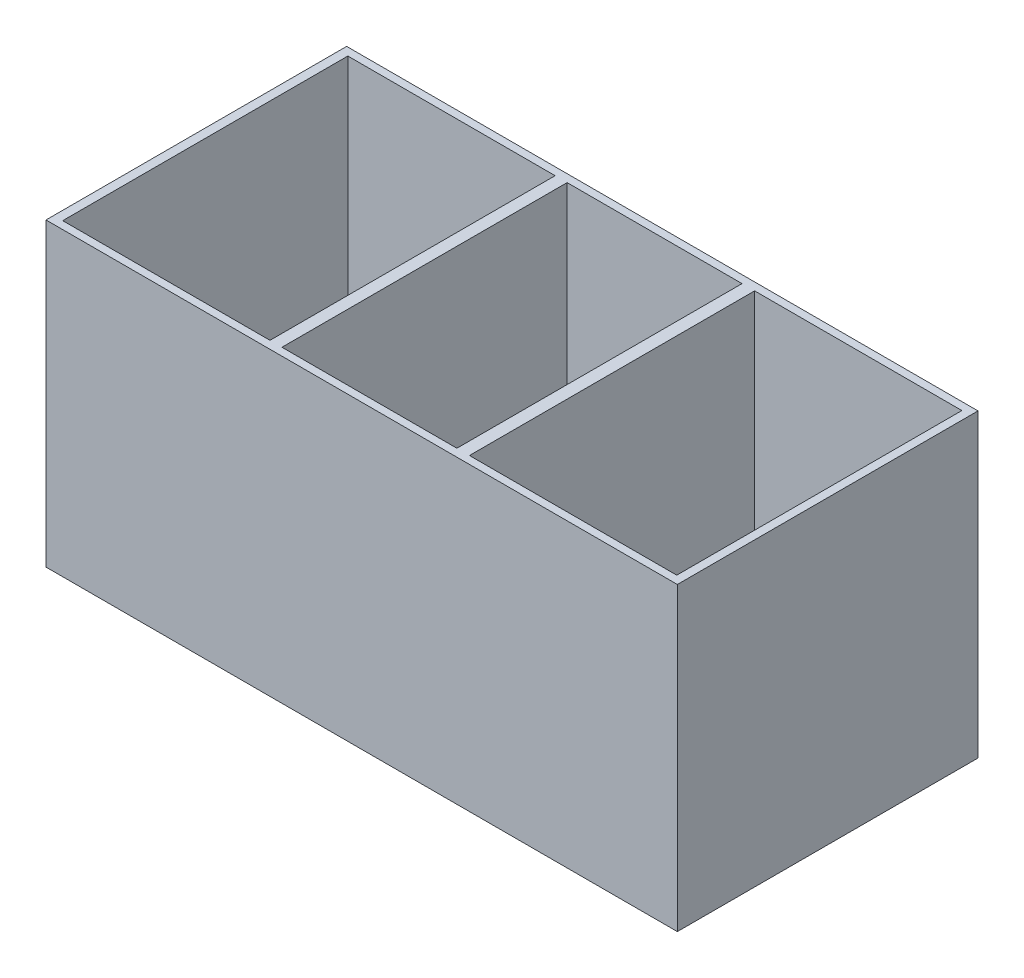
ISO-10303-21;
HEADER;
FILE_DESCRIPTION(('STEP AP214'),'2;1');
FILE_NAME('part.step','',(''),(''),'','','');
FILE_SCHEMA(('AUTOMOTIVE_DESIGN { 1 0 10303 214 1 1 1 1 }'));
ENDSEC;
DATA;
#1=APPLICATION_CONTEXT('core data for automotive mechanical design processes');
#2=APPLICATION_PROTOCOL_DEFINITION('international standard','automotive_design',2000,#1);
#3=PRODUCT_CONTEXT('',#1,'mechanical');
#4=PRODUCT('Part','Part','',(#3));
#5=PRODUCT_RELATED_PRODUCT_CATEGORY('part','',(#4));
#6=PRODUCT_DEFINITION_FORMATION('','',#4);
#7=PRODUCT_DEFINITION_CONTEXT('part definition',#1,'design');
#8=PRODUCT_DEFINITION('design','',#6,#7);
#9=PRODUCT_DEFINITION_SHAPE('','',#8);
#10=(LENGTH_UNIT() NAMED_UNIT(*) SI_UNIT(.MILLI.,.METRE.));
#11=(NAMED_UNIT(*) PLANE_ANGLE_UNIT() SI_UNIT($,.RADIAN.));
#12=(NAMED_UNIT(*) SI_UNIT($,.STERADIAN.) SOLID_ANGLE_UNIT());
#13=UNCERTAINTY_MEASURE_WITH_UNIT(LENGTH_MEASURE(1.E-05),#10,'distance_accuracy_value','');
#14=(GEOMETRIC_REPRESENTATION_CONTEXT(3) GLOBAL_UNCERTAINTY_ASSIGNED_CONTEXT((#13)) GLOBAL_UNIT_ASSIGNED_CONTEXT((#10,
#11,#12)) REPRESENTATION_CONTEXT('',''));
#15=CARTESIAN_POINT('',(0.,0.,0.));
#16=DIRECTION('',(0.,0.,1.));
#17=DIRECTION('',(1.,0.,0.));
#18=AXIS2_PLACEMENT_3D('',#15,#16,#17);
#19=CARTESIAN_POINT('',(105.,100.,-50.));
#20=DIRECTION('',(-1.,0.,0.));
#21=DIRECTION('',(0.,0.,1.));
#22=AXIS2_PLACEMENT_3D('',#19,#20,#21);
#23=PLANE('',#22);
#24=DIRECTION('',(0.,0.,-1.));
#25=VECTOR('',#24,1.);
#26=CARTESIAN_POINT('',(105.,0.,-50.));
#27=LINE('',#26,#25);
#28=CARTESIAN_POINT('',(105.,0.,50.));
#29=VERTEX_POINT('',#28);
#30=CARTESIAN_POINT('',(105.,0.,-50.));
#31=VERTEX_POINT('',#30);
#32=EDGE_CURVE('E186',#29,#31,#27,.T.);
#33=ORIENTED_EDGE('',*,*,#32,.T.);
#34=DIRECTION('',(0.,-1.,0.));
#35=VECTOR('',#34,1.);
#36=CARTESIAN_POINT('',(105.,100.,-50.));
#37=LINE('',#36,#35);
#38=CARTESIAN_POINT('',(105.,100.,-50.));
#39=VERTEX_POINT('',#38);
#40=EDGE_CURVE('E11',#39,#31,#37,.T.);
#41=ORIENTED_EDGE('',*,*,#40,.F.);
#42=DIRECTION('',(0.,0.,-1.));
#43=VECTOR('',#42,1.);
#44=CARTESIAN_POINT('',(105.,100.,-50.));
#45=LINE('',#44,#43);
#46=CARTESIAN_POINT('',(105.,100.,50.));
#47=VERTEX_POINT('',#46);
#48=EDGE_CURVE('E255',#47,#39,#45,.T.);
#49=ORIENTED_EDGE('',*,*,#48,.F.);
#50=DIRECTION('',(0.,-1.,0.));
#51=VECTOR('',#50,1.);
#52=CARTESIAN_POINT('',(105.,100.,50.));
#53=LINE('',#52,#51);
#54=EDGE_CURVE('E265',#47,#29,#53,.T.);
#55=ORIENTED_EDGE('',*,*,#54,.T.);
#56=EDGE_LOOP('',(#33,#41,#49,#55));
#57=FACE_BOUND('',#56,.T.);
#58=ADVANCED_FACE('F39',(#57),#23,.F.);
#59=CARTESIAN_POINT('',(-105.,100.,-50.));
#60=DIRECTION('',(0.,0.,1.));
#61=DIRECTION('',(1.,0.,0.));
#62=AXIS2_PLACEMENT_3D('',#59,#60,#61);
#63=PLANE('',#62);
#64=DIRECTION('',(-1.,0.,0.));
#65=VECTOR('',#64,1.);
#66=CARTESIAN_POINT('',(-105.,0.,-50.));
#67=LINE('',#66,#65);
#68=CARTESIAN_POINT('',(-105.,0.,-50.));
#69=VERTEX_POINT('',#68);
#70=EDGE_CURVE('E262',#31,#69,#67,.T.);
#71=ORIENTED_EDGE('',*,*,#70,.T.);
#72=DIRECTION('',(0.,-1.,0.));
#73=VECTOR('',#72,1.);
#74=CARTESIAN_POINT('',(-105.,100.,-50.));
#75=LINE('',#74,#73);
#76=CARTESIAN_POINT('',(-105.,100.,-50.));
#77=VERTEX_POINT('',#76);
#78=EDGE_CURVE('E46',#77,#69,#75,.T.);
#79=ORIENTED_EDGE('',*,*,#78,.F.);
#80=DIRECTION('',(-1.,0.,0.));
#81=VECTOR('',#80,1.);
#82=CARTESIAN_POINT('',(-105.,100.,-50.));
#83=LINE('',#82,#81);
#84=EDGE_CURVE('E251',#39,#77,#83,.T.);
#85=ORIENTED_EDGE('',*,*,#84,.F.);
#86=ORIENTED_EDGE('',*,*,#40,.T.);
#87=EDGE_LOOP('',(#71,#79,#85,#86));
#88=FACE_BOUND('',#87,.T.);
#89=ADVANCED_FACE('F293',(#88),#63,.F.);
#90=CARTESIAN_POINT('',(-105.,100.,-50.));
#91=DIRECTION('',(1.,0.,0.));
#92=DIRECTION('',(0.,0.,-1.));
#93=AXIS2_PLACEMENT_3D('',#90,#91,#92);
#94=PLANE('',#93);
#95=DIRECTION('',(0.,0.,1.));
#96=VECTOR('',#95,1.);
#97=CARTESIAN_POINT('',(-105.,0.,-50.));
#98=LINE('',#97,#96);
#99=CARTESIAN_POINT('',(-105.,0.,50.));
#100=VERTEX_POINT('',#99);
#101=EDGE_CURVE('E270',#69,#100,#98,.T.);
#102=ORIENTED_EDGE('',*,*,#101,.T.);
#103=DIRECTION('',(0.,-1.,0.));
#104=VECTOR('',#103,1.);
#105=CARTESIAN_POINT('',(-105.,100.,50.));
#106=LINE('',#105,#104);
#107=CARTESIAN_POINT('',(-105.,100.,50.));
#108=VERTEX_POINT('',#107);
#109=EDGE_CURVE('E275',#108,#100,#106,.T.);
#110=ORIENTED_EDGE('',*,*,#109,.F.);
#111=DIRECTION('',(0.,0.,1.));
#112=VECTOR('',#111,1.);
#113=CARTESIAN_POINT('',(-105.,100.,-50.));
#114=LINE('',#113,#112);
#115=EDGE_CURVE('E256',#77,#108,#114,.T.);
#116=ORIENTED_EDGE('',*,*,#115,.F.);
#117=ORIENTED_EDGE('',*,*,#78,.T.);
#118=EDGE_LOOP('',(#102,#110,#116,#117));
#119=FACE_BOUND('',#118,.T.);
#120=ADVANCED_FACE('F278',(#119),#94,.F.);
#121=CARTESIAN_POINT('',(-105.,100.,50.));
#122=DIRECTION('',(0.,0.,-1.));
#123=DIRECTION('',(-1.,0.,0.));
#124=AXIS2_PLACEMENT_3D('',#121,#122,#123);
#125=PLANE('',#124);
#126=DIRECTION('',(1.,0.,0.));
#127=VECTOR('',#126,1.);
#128=CARTESIAN_POINT('',(-105.,0.,50.));
#129=LINE('',#128,#127);
#130=EDGE_CURVE('E258',#100,#29,#129,.T.);
#131=ORIENTED_EDGE('',*,*,#130,.T.);
#132=ORIENTED_EDGE('',*,*,#54,.F.);
#133=DIRECTION('',(1.,0.,0.));
#134=VECTOR('',#133,1.);
#135=CARTESIAN_POINT('',(-105.,100.,50.));
#136=LINE('',#135,#134);
#137=EDGE_CURVE('E259',#108,#47,#136,.T.);
#138=ORIENTED_EDGE('',*,*,#137,.F.);
#139=ORIENTED_EDGE('',*,*,#109,.T.);
#140=EDGE_LOOP('',(#131,#132,#138,#139));
#141=FACE_BOUND('',#140,.T.);
#142=ADVANCED_FACE('F288',(#141),#125,.F.);
#143=CARTESIAN_POINT('',(0.,100.,0.));
#144=DIRECTION('',(0.,1.,0.));
#145=DIRECTION('',(0.,0.,1.));
#146=AXIS2_PLACEMENT_3D('',#143,#144,#145);
#147=PLANE('',#146);
#148=DIRECTION('',(0.,0.,-1.));
#149=VECTOR('',#148,1.);
#150=CARTESIAN_POINT('',(-33.0770005215608,100.,-47.4236513501892));
#151=LINE('',#150,#149);
#152=CARTESIAN_POINT('',(-33.0770005215608,100.,47.4236513501892));
#153=VERTEX_POINT('',#152);
#154=CARTESIAN_POINT('',(-33.0770005215608,100.,-47.4236513501892));
#155=VERTEX_POINT('',#154);
#156=EDGE_CURVE('E52',#153,#155,#151,.T.);
#157=ORIENTED_EDGE('',*,*,#156,.F.);
#158=DIRECTION('',(1.,0.,0.));
#159=VECTOR('',#158,1.);
#160=CARTESIAN_POINT('',(-102.020628114694,100.,47.4236513501892));
#161=LINE('',#160,#159);
#162=CARTESIAN_POINT('',(-102.020628114694,100.,47.4236513501892));
#163=VERTEX_POINT('',#162);
#164=EDGE_CURVE('E173',#163,#153,#161,.T.);
#165=ORIENTED_EDGE('',*,*,#164,.F.);
#166=DIRECTION('',(0.,0.,1.));
#167=VECTOR('',#166,1.);
#168=CARTESIAN_POINT('',(-102.020628114694,100.,-47.4236513501892));
#169=LINE('',#168,#167);
#170=CARTESIAN_POINT('',(-102.020628114694,100.,-47.4236513501892));
#171=VERTEX_POINT('',#170);
#172=EDGE_CURVE('E174',#171,#163,#169,.T.);
#173=ORIENTED_EDGE('',*,*,#172,.F.);
#174=DIRECTION('',(-1.,0.,0.));
#175=VECTOR('',#174,1.);
#176=CARTESIAN_POINT('',(-102.020628114694,100.,-47.4236513501892));
#177=LINE('',#176,#175);
#178=EDGE_CURVE('E179',#155,#171,#177,.T.);
#179=ORIENTED_EDGE('',*,*,#178,.F.);
#180=EDGE_LOOP('',(#157,#165,#173,#179));
#181=FACE_BOUND('',#180,.T.);
#182=DIRECTION('',(0.,0.,-1.));
#183=VECTOR('',#182,1.);
#184=CARTESIAN_POINT('',(29.0918197358305,100.,-47.4236513501892));
#185=LINE('',#184,#183);
#186=CARTESIAN_POINT('',(29.0918197358305,100.,47.4236513501892));
#187=VERTEX_POINT('',#186);
#188=CARTESIAN_POINT('',(29.0918197358305,100.,-47.4236513501892));
#189=VERTEX_POINT('',#188);
#190=EDGE_CURVE('E62',#187,#189,#185,.T.);
#191=ORIENTED_EDGE('',*,*,#190,.F.);
#192=DIRECTION('',(1.,0.,0.));
#193=VECTOR('',#192,1.);
#194=CARTESIAN_POINT('',(-29.0918197358305,100.,47.4236513501892));
#195=LINE('',#194,#193);
#196=CARTESIAN_POINT('',(-29.0918197358305,100.,47.4236513501892));
#197=VERTEX_POINT('',#196);
#198=EDGE_CURVE('E196',#197,#187,#195,.T.);
#199=ORIENTED_EDGE('',*,*,#198,.F.);
#200=DIRECTION('',(0.,0.,1.));
#201=VECTOR('',#200,1.);
#202=CARTESIAN_POINT('',(-29.0918197358305,100.,-47.4236513501892));
#203=LINE('',#202,#201);
#204=CARTESIAN_POINT('',(-29.0918197358305,100.,-47.4236513501892));
#205=VERTEX_POINT('',#204);
#206=EDGE_CURVE('E201',#205,#197,#203,.T.);
#207=ORIENTED_EDGE('',*,*,#206,.F.);
#208=DIRECTION('',(-1.,0.,0.));
#209=VECTOR('',#208,1.);
#210=CARTESIAN_POINT('',(-29.0918197358305,100.,-47.4236513501892));
#211=LINE('',#210,#209);
#212=EDGE_CURVE('E210',#189,#205,#211,.T.);
#213=ORIENTED_EDGE('',*,*,#212,.F.);
#214=EDGE_LOOP('',(#191,#199,#207,#213));
#215=FACE_BOUND('',#214,.T.);
#216=DIRECTION('',(0.,0.,-1.));
#217=VECTOR('',#216,1.);
#218=CARTESIAN_POINT('',(102.21988715398,100.,-47.4236513501892));
#219=LINE('',#218,#217);
#220=CARTESIAN_POINT('',(102.21988715398,100.,47.4236513501892));
#221=VERTEX_POINT('',#220);
#222=CARTESIAN_POINT('',(102.21988715398,100.,-47.4236513501892));
#223=VERTEX_POINT('',#222);
#224=EDGE_CURVE('E199',#221,#223,#219,.T.);
#225=ORIENTED_EDGE('',*,*,#224,.F.);
#226=DIRECTION('',(1.,0.,0.));
#227=VECTOR('',#226,1.);
#228=CARTESIAN_POINT('',(33.2762595608473,100.,47.4236513501892));
#229=LINE('',#228,#227);
#230=CARTESIAN_POINT('',(33.2762595608473,100.,47.4236513501892));
#231=VERTEX_POINT('',#230);
#232=EDGE_CURVE('E231',#231,#221,#229,.T.);
#233=ORIENTED_EDGE('',*,*,#232,.F.);
#234=DIRECTION('',(0.,0.,1.));
#235=VECTOR('',#234,1.);
#236=CARTESIAN_POINT('',(33.2762595608473,100.,-47.4236513501892));
#237=LINE('',#236,#235);
#238=CARTESIAN_POINT('',(33.2762595608473,100.,-47.4236513501892));
#239=VERTEX_POINT('',#238);
#240=EDGE_CURVE('E233',#239,#231,#237,.T.);
#241=ORIENTED_EDGE('',*,*,#240,.F.);
#242=DIRECTION('',(-1.,0.,0.));
#243=VECTOR('',#242,1.);
#244=CARTESIAN_POINT('',(33.2762595608473,100.,-47.4236513501892));
#245=LINE('',#244,#243);
#246=EDGE_CURVE('E239',#223,#239,#245,.T.);
#247=ORIENTED_EDGE('',*,*,#246,.F.);
#248=EDGE_LOOP('',(#225,#233,#241,#247));
#249=FACE_BOUND('',#248,.T.);
#250=ORIENTED_EDGE('',*,*,#48,.T.);
#251=ORIENTED_EDGE('',*,*,#84,.T.);
#252=ORIENTED_EDGE('',*,*,#115,.T.);
#253=ORIENTED_EDGE('',*,*,#137,.T.);
#254=EDGE_LOOP('',(#250,#251,#252,#253));
#255=FACE_BOUND('',#254,.T.);
#256=ADVANCED_FACE('F294',(#181,#215,#249,#255),#147,.T.);
#257=CARTESIAN_POINT('',(0.,0.,0.));
#258=DIRECTION('',(0.,1.,0.));
#259=DIRECTION('',(0.,0.,1.));
#260=AXIS2_PLACEMENT_3D('',#257,#258,#259);
#261=PLANE('',#260);
#262=ORIENTED_EDGE('',*,*,#32,.F.);
#263=ORIENTED_EDGE('',*,*,#130,.F.);
#264=ORIENTED_EDGE('',*,*,#101,.F.);
#265=ORIENTED_EDGE('',*,*,#70,.F.);
#266=EDGE_LOOP('',(#262,#263,#264,#265));
#267=FACE_BOUND('',#266,.T.);
#268=ADVANCED_FACE('F283',(#267),#261,.F.);
#269=CARTESIAN_POINT('',(102.21988715398,5.,-47.4236513501892));
#270=DIRECTION('',(1.,0.,0.));
#271=DIRECTION('',(0.,0.,-1.));
#272=AXIS2_PLACEMENT_3D('',#269,#270,#271);
#273=PLANE('',#272);
#274=ORIENTED_EDGE('',*,*,#224,.T.);
#275=DIRECTION('',(0.,1.,0.));
#276=VECTOR('',#275,1.);
#277=CARTESIAN_POINT('',(102.21988715398,5.,-47.4236513501892));
#278=LINE('',#277,#276);
#279=CARTESIAN_POINT('',(102.21988715398,5.,-47.4236513501892));
#280=VERTEX_POINT('',#279);
#281=EDGE_CURVE('E221',#280,#223,#278,.T.);
#282=ORIENTED_EDGE('',*,*,#281,.F.);
#283=DIRECTION('',(0.,0.,-1.));
#284=VECTOR('',#283,1.);
#285=CARTESIAN_POINT('',(102.21988715398,5.,-47.4236513501892));
#286=LINE('',#285,#284);
#287=CARTESIAN_POINT('',(102.21988715398,5.,47.4236513501892));
#288=VERTEX_POINT('',#287);
#289=EDGE_CURVE('E234',#288,#280,#286,.T.);
#290=ORIENTED_EDGE('',*,*,#289,.F.);
#291=DIRECTION('',(0.,1.,0.));
#292=VECTOR('',#291,1.);
#293=CARTESIAN_POINT('',(102.21988715398,5.,47.4236513501892));
#294=LINE('',#293,#292);
#295=EDGE_CURVE('E227',#288,#221,#294,.T.);
#296=ORIENTED_EDGE('',*,*,#295,.T.);
#297=EDGE_LOOP('',(#274,#282,#290,#296));
#298=FACE_BOUND('',#297,.T.);
#299=ADVANCED_FACE('F310',(#298),#273,.F.);
#300=CARTESIAN_POINT('',(33.2762595608473,5.,47.4236513501892));
#301=DIRECTION('',(0.,0.,1.));
#302=DIRECTION('',(1.,0.,0.));
#303=AXIS2_PLACEMENT_3D('',#300,#301,#302);
#304=PLANE('',#303);
#305=ORIENTED_EDGE('',*,*,#232,.T.);
#306=ORIENTED_EDGE('',*,*,#295,.F.);
#307=DIRECTION('',(1.,0.,0.));
#308=VECTOR('',#307,1.);
#309=CARTESIAN_POINT('',(33.2762595608473,5.,47.4236513501892));
#310=LINE('',#309,#308);
#311=CARTESIAN_POINT('',(33.2762595608473,5.,47.4236513501892));
#312=VERTEX_POINT('',#311);
#313=EDGE_CURVE('E222',#312,#288,#310,.T.);
#314=ORIENTED_EDGE('',*,*,#313,.F.);
#315=DIRECTION('',(0.,1.,0.));
#316=VECTOR('',#315,1.);
#317=CARTESIAN_POINT('',(33.2762595608473,5.,47.4236513501892));
#318=LINE('',#317,#316);
#319=EDGE_CURVE('E230',#312,#231,#318,.T.);
#320=ORIENTED_EDGE('',*,*,#319,.T.);
#321=EDGE_LOOP('',(#305,#306,#314,#320));
#322=FACE_BOUND('',#321,.T.);
#323=ADVANCED_FACE('F320',(#322),#304,.F.);
#324=CARTESIAN_POINT('',(33.2762595608473,5.,-47.4236513501892));
#325=DIRECTION('',(-1.,0.,0.));
#326=DIRECTION('',(0.,0.,1.));
#327=AXIS2_PLACEMENT_3D('',#324,#325,#326);
#328=PLANE('',#327);
#329=ORIENTED_EDGE('',*,*,#240,.T.);
#330=ORIENTED_EDGE('',*,*,#319,.F.);
#331=DIRECTION('',(0.,0.,1.));
#332=VECTOR('',#331,1.);
#333=CARTESIAN_POINT('',(33.2762595608473,5.,-47.4236513501892));
#334=LINE('',#333,#332);
#335=CARTESIAN_POINT('',(33.2762595608473,5.,-47.4236513501892));
#336=VERTEX_POINT('',#335);
#337=EDGE_CURVE('E244',#336,#312,#334,.T.);
#338=ORIENTED_EDGE('',*,*,#337,.F.);
#339=DIRECTION('',(0.,1.,0.));
#340=VECTOR('',#339,1.);
#341=CARTESIAN_POINT('',(33.2762595608473,5.,-47.4236513501892));
#342=LINE('',#341,#340);
#343=EDGE_CURVE('E224',#336,#239,#342,.T.);
#344=ORIENTED_EDGE('',*,*,#343,.T.);
#345=EDGE_LOOP('',(#329,#330,#338,#344));
#346=FACE_BOUND('',#345,.T.);
#347=ADVANCED_FACE('F319',(#346),#328,.F.);
#348=CARTESIAN_POINT('',(33.2762595608473,5.,-47.4236513501892));
#349=DIRECTION('',(0.,0.,-1.));
#350=DIRECTION('',(-1.,0.,0.));
#351=AXIS2_PLACEMENT_3D('',#348,#349,#350);
#352=PLANE('',#351);
#353=ORIENTED_EDGE('',*,*,#246,.T.);
#354=ORIENTED_EDGE('',*,*,#343,.F.);
#355=DIRECTION('',(-1.,0.,0.));
#356=VECTOR('',#355,1.);
#357=CARTESIAN_POINT('',(33.2762595608473,5.,-47.4236513501892));
#358=LINE('',#357,#356);
#359=EDGE_CURVE('E250',#280,#336,#358,.T.);
#360=ORIENTED_EDGE('',*,*,#359,.F.);
#361=ORIENTED_EDGE('',*,*,#281,.T.);
#362=EDGE_LOOP('',(#353,#354,#360,#361));
#363=FACE_BOUND('',#362,.T.);
#364=ADVANCED_FACE('F314',(#363),#352,.F.);
#365=CARTESIAN_POINT('',(0.,5.,0.));
#366=DIRECTION('',(0.,1.,0.));
#367=DIRECTION('',(0.,0.,1.));
#368=AXIS2_PLACEMENT_3D('',#365,#366,#367);
#369=PLANE('',#368);
#370=ORIENTED_EDGE('',*,*,#289,.T.);
#371=ORIENTED_EDGE('',*,*,#359,.T.);
#372=ORIENTED_EDGE('',*,*,#337,.T.);
#373=ORIENTED_EDGE('',*,*,#313,.T.);
#374=EDGE_LOOP('',(#370,#371,#372,#373));
#375=FACE_BOUND('',#374,.T.);
#376=ADVANCED_FACE('F311',(#375),#369,.T.);
#377=CARTESIAN_POINT('',(29.0918197358305,5.,-47.4236513501892));
#378=DIRECTION('',(1.,0.,0.));
#379=DIRECTION('',(0.,0.,-1.));
#380=AXIS2_PLACEMENT_3D('',#377,#378,#379);
#381=PLANE('',#380);
#382=ORIENTED_EDGE('',*,*,#190,.T.);
#383=DIRECTION('',(0.,1.,0.));
#384=VECTOR('',#383,1.);
#385=CARTESIAN_POINT('',(29.0918197358305,5.,-47.4236513501892));
#386=LINE('',#385,#384);
#387=CARTESIAN_POINT('',(29.0918197358305,5.,-47.4236513501892));
#388=VERTEX_POINT('',#387);
#389=EDGE_CURVE('E189',#388,#189,#386,.T.);
#390=ORIENTED_EDGE('',*,*,#389,.F.);
#391=DIRECTION('',(0.,0.,-1.));
#392=VECTOR('',#391,1.);
#393=CARTESIAN_POINT('',(29.0918197358305,5.,-47.4236513501892));
#394=LINE('',#393,#392);
#395=CARTESIAN_POINT('',(29.0918197358305,5.,47.4236513501892));
#396=VERTEX_POINT('',#395);
#397=EDGE_CURVE('E204',#396,#388,#394,.T.);
#398=ORIENTED_EDGE('',*,*,#397,.F.);
#399=DIRECTION('',(0.,1.,0.));
#400=VECTOR('',#399,1.);
#401=CARTESIAN_POINT('',(29.0918197358305,5.,47.4236513501892));
#402=LINE('',#401,#400);
#403=EDGE_CURVE('E200',#396,#187,#402,.T.);
#404=ORIENTED_EDGE('',*,*,#403,.T.);
#405=EDGE_LOOP('',(#382,#390,#398,#404));
#406=FACE_BOUND('',#405,.T.);
#407=ADVANCED_FACE('F312',(#406),#381,.F.);
#408=CARTESIAN_POINT('',(-29.0918197358305,5.,47.4236513501892));
#409=DIRECTION('',(0.,0.,1.));
#410=DIRECTION('',(1.,0.,0.));
#411=AXIS2_PLACEMENT_3D('',#408,#409,#410);
#412=PLANE('',#411);
#413=ORIENTED_EDGE('',*,*,#198,.T.);
#414=ORIENTED_EDGE('',*,*,#403,.F.);
#415=DIRECTION('',(1.,0.,0.));
#416=VECTOR('',#415,1.);
#417=CARTESIAN_POINT('',(-29.0918197358305,5.,47.4236513501892));
#418=LINE('',#417,#416);
#419=CARTESIAN_POINT('',(-29.0918197358305,5.,47.4236513501892));
#420=VERTEX_POINT('',#419);
#421=EDGE_CURVE('E195',#420,#396,#418,.T.);
#422=ORIENTED_EDGE('',*,*,#421,.F.);
#423=DIRECTION('',(0.,1.,0.));
#424=VECTOR('',#423,1.);
#425=CARTESIAN_POINT('',(-29.0918197358305,5.,47.4236513501892));
#426=LINE('',#425,#424);
#427=EDGE_CURVE('E193',#420,#197,#426,.T.);
#428=ORIENTED_EDGE('',*,*,#427,.T.);
#429=EDGE_LOOP('',(#413,#414,#422,#428));
#430=FACE_BOUND('',#429,.T.);
#431=ADVANCED_FACE('F337',(#430),#412,.F.);
#432=CARTESIAN_POINT('',(-29.0918197358305,5.,-47.4236513501892));
#433=DIRECTION('',(-1.,0.,0.));
#434=DIRECTION('',(0.,0.,1.));
#435=AXIS2_PLACEMENT_3D('',#432,#433,#434);
#436=PLANE('',#435);
#437=ORIENTED_EDGE('',*,*,#206,.T.);
#438=ORIENTED_EDGE('',*,*,#427,.F.);
#439=DIRECTION('',(0.,0.,1.));
#440=VECTOR('',#439,1.);
#441=CARTESIAN_POINT('',(-29.0918197358305,5.,-47.4236513501892));
#442=LINE('',#441,#440);
#443=CARTESIAN_POINT('',(-29.0918197358305,5.,-47.4236513501892));
#444=VERTEX_POINT('',#443);
#445=EDGE_CURVE('E211',#444,#420,#442,.T.);
#446=ORIENTED_EDGE('',*,*,#445,.F.);
#447=DIRECTION('',(0.,1.,0.));
#448=VECTOR('',#447,1.);
#449=CARTESIAN_POINT('',(-29.0918197358305,5.,-47.4236513501892));
#450=LINE('',#449,#448);
#451=EDGE_CURVE('E194',#444,#205,#450,.T.);
#452=ORIENTED_EDGE('',*,*,#451,.T.);
#453=EDGE_LOOP('',(#437,#438,#446,#452));
#454=FACE_BOUND('',#453,.T.);
#455=ADVANCED_FACE('F339',(#454),#436,.F.);
#456=CARTESIAN_POINT('',(-29.0918197358305,5.,-47.4236513501892));
#457=DIRECTION('',(0.,0.,-1.));
#458=DIRECTION('',(-1.,0.,0.));
#459=AXIS2_PLACEMENT_3D('',#456,#457,#458);
#460=PLANE('',#459);
#461=ORIENTED_EDGE('',*,*,#212,.T.);
#462=ORIENTED_EDGE('',*,*,#451,.F.);
#463=DIRECTION('',(-1.,0.,0.));
#464=VECTOR('',#463,1.);
#465=CARTESIAN_POINT('',(-29.0918197358305,5.,-47.4236513501892));
#466=LINE('',#465,#464);
#467=EDGE_CURVE('E218',#388,#444,#466,.T.);
#468=ORIENTED_EDGE('',*,*,#467,.F.);
#469=ORIENTED_EDGE('',*,*,#389,.T.);
#470=EDGE_LOOP('',(#461,#462,#468,#469));
#471=FACE_BOUND('',#470,.T.);
#472=ADVANCED_FACE('F334',(#471),#460,.F.);
#473=CARTESIAN_POINT('',(0.,5.,0.));
#474=DIRECTION('',(0.,1.,0.));
#475=DIRECTION('',(0.,0.,1.));
#476=AXIS2_PLACEMENT_3D('',#473,#474,#475);
#477=PLANE('',#476);
#478=ORIENTED_EDGE('',*,*,#397,.T.);
#479=ORIENTED_EDGE('',*,*,#467,.T.);
#480=ORIENTED_EDGE('',*,*,#445,.T.);
#481=ORIENTED_EDGE('',*,*,#421,.T.);
#482=EDGE_LOOP('',(#478,#479,#480,#481));
#483=FACE_BOUND('',#482,.T.);
#484=ADVANCED_FACE('F332',(#483),#477,.T.);
#485=CARTESIAN_POINT('',(-33.0770005215608,5.,-47.4236513501892));
#486=DIRECTION('',(1.,0.,0.));
#487=DIRECTION('',(0.,0.,-1.));
#488=AXIS2_PLACEMENT_3D('',#485,#486,#487);
#489=PLANE('',#488);
#490=ORIENTED_EDGE('',*,*,#156,.T.);
#491=DIRECTION('',(0.,1.,0.));
#492=VECTOR('',#491,1.);
#493=CARTESIAN_POINT('',(-33.0770005215608,5.,-47.4236513501892));
#494=LINE('',#493,#492);
#495=CARTESIAN_POINT('',(-33.0770005215608,5.,-47.4236513501892));
#496=VERTEX_POINT('',#495);
#497=EDGE_CURVE('E146',#496,#155,#494,.T.);
#498=ORIENTED_EDGE('',*,*,#497,.F.);
#499=DIRECTION('',(0.,0.,-1.));
#500=VECTOR('',#499,1.);
#501=CARTESIAN_POINT('',(-33.0770005215608,5.,-47.4236513501892));
#502=LINE('',#501,#500);
#503=CARTESIAN_POINT('',(-33.0770005215608,5.,47.4236513501892));
#504=VERTEX_POINT('',#503);
#505=EDGE_CURVE('E153',#504,#496,#502,.T.);
#506=ORIENTED_EDGE('',*,*,#505,.F.);
#507=DIRECTION('',(0.,1.,0.));
#508=VECTOR('',#507,1.);
#509=CARTESIAN_POINT('',(-33.0770005215608,5.,47.4236513501892));
#510=LINE('',#509,#508);
#511=EDGE_CURVE('E182',#504,#153,#510,.T.);
#512=ORIENTED_EDGE('',*,*,#511,.T.);
#513=EDGE_LOOP('',(#490,#498,#506,#512));
#514=FACE_BOUND('',#513,.T.);
#515=ADVANCED_FACE('F152',(#514),#489,.F.);
#516=CARTESIAN_POINT('',(-102.020628114694,5.,47.4236513501892));
#517=DIRECTION('',(0.,0.,1.));
#518=DIRECTION('',(1.,0.,0.));
#519=AXIS2_PLACEMENT_3D('',#516,#517,#518);
#520=PLANE('',#519);
#521=ORIENTED_EDGE('',*,*,#164,.T.);
#522=ORIENTED_EDGE('',*,*,#511,.F.);
#523=DIRECTION('',(1.,0.,0.));
#524=VECTOR('',#523,1.);
#525=CARTESIAN_POINT('',(-102.020628114694,5.,47.4236513501892));
#526=LINE('',#525,#524);
#527=CARTESIAN_POINT('',(-102.020628114694,5.,47.4236513501892));
#528=VERTEX_POINT('',#527);
#529=EDGE_CURVE('E159',#528,#504,#526,.T.);
#530=ORIENTED_EDGE('',*,*,#529,.F.);
#531=DIRECTION('',(0.,1.,0.));
#532=VECTOR('',#531,1.);
#533=CARTESIAN_POINT('',(-102.020628114694,5.,47.4236513501892));
#534=LINE('',#533,#532);
#535=EDGE_CURVE('E190',#528,#163,#534,.T.);
#536=ORIENTED_EDGE('',*,*,#535,.T.);
#537=EDGE_LOOP('',(#521,#522,#530,#536));
#538=FACE_BOUND('',#537,.T.);
#539=ADVANCED_FACE('F353',(#538),#520,.F.);
#540=CARTESIAN_POINT('',(-102.020628114694,5.,-47.4236513501892));
#541=DIRECTION('',(-1.,0.,0.));
#542=DIRECTION('',(0.,0.,1.));
#543=AXIS2_PLACEMENT_3D('',#540,#541,#542);
#544=PLANE('',#543);
#545=ORIENTED_EDGE('',*,*,#172,.T.);
#546=ORIENTED_EDGE('',*,*,#535,.F.);
#547=DIRECTION('',(0.,0.,1.));
#548=VECTOR('',#547,1.);
#549=CARTESIAN_POINT('',(-102.020628114694,5.,-47.4236513501892));
#550=LINE('',#549,#548);
#551=CARTESIAN_POINT('',(-102.020628114694,5.,-47.4236513501892));
#552=VERTEX_POINT('',#551);
#553=EDGE_CURVE('E167',#552,#528,#550,.T.);
#554=ORIENTED_EDGE('',*,*,#553,.F.);
#555=DIRECTION('',(0.,1.,0.));
#556=VECTOR('',#555,1.);
#557=CARTESIAN_POINT('',(-102.020628114694,5.,-47.4236513501892));
#558=LINE('',#557,#556);
#559=EDGE_CURVE('E156',#552,#171,#558,.T.);
#560=ORIENTED_EDGE('',*,*,#559,.T.);
#561=EDGE_LOOP('',(#545,#546,#554,#560));
#562=FACE_BOUND('',#561,.T.);
#563=ADVANCED_FACE('F354',(#562),#544,.F.);
#564=CARTESIAN_POINT('',(-102.020628114694,5.,-47.4236513501892));
#565=DIRECTION('',(0.,0.,-1.));
#566=DIRECTION('',(-1.,0.,0.));
#567=AXIS2_PLACEMENT_3D('',#564,#565,#566);
#568=PLANE('',#567);
#569=ORIENTED_EDGE('',*,*,#178,.T.);
#570=ORIENTED_EDGE('',*,*,#559,.F.);
#571=DIRECTION('',(-1.,0.,0.));
#572=VECTOR('',#571,1.);
#573=CARTESIAN_POINT('',(-102.020628114694,5.,-47.4236513501892));
#574=LINE('',#573,#572);
#575=EDGE_CURVE('E165',#496,#552,#574,.T.);
#576=ORIENTED_EDGE('',*,*,#575,.F.);
#577=ORIENTED_EDGE('',*,*,#497,.T.);
#578=EDGE_LOOP('',(#569,#570,#576,#577));
#579=FACE_BOUND('',#578,.T.);
#580=ADVANCED_FACE('F163',(#579),#568,.F.);
#581=CARTESIAN_POINT('',(0.,5.,0.));
#582=DIRECTION('',(0.,1.,0.));
#583=DIRECTION('',(0.,0.,1.));
#584=AXIS2_PLACEMENT_3D('',#581,#582,#583);
#585=PLANE('',#584);
#586=ORIENTED_EDGE('',*,*,#505,.T.);
#587=ORIENTED_EDGE('',*,*,#575,.T.);
#588=ORIENTED_EDGE('',*,*,#553,.T.);
#589=ORIENTED_EDGE('',*,*,#529,.T.);
#590=EDGE_LOOP('',(#586,#587,#588,#589));
#591=FACE_BOUND('',#590,.T.);
#592=ADVANCED_FACE('F170',(#591),#585,.T.);
#593=CLOSED_SHELL('',(#58,#89,#120,#142,#256,#268,#299,#323,#347,#364,#376,#407,#431,#455,#472,
#484,#515,#539,#563,#580,#592));
#594=MANIFOLD_SOLID_BREP('B2',#593);
#595=ADVANCED_BREP_SHAPE_REPRESENTATION('',(#18,#594),#14);
#596=SHAPE_DEFINITION_REPRESENTATION(#9,#595);
ENDSEC;
END-ISO-10303-21;
